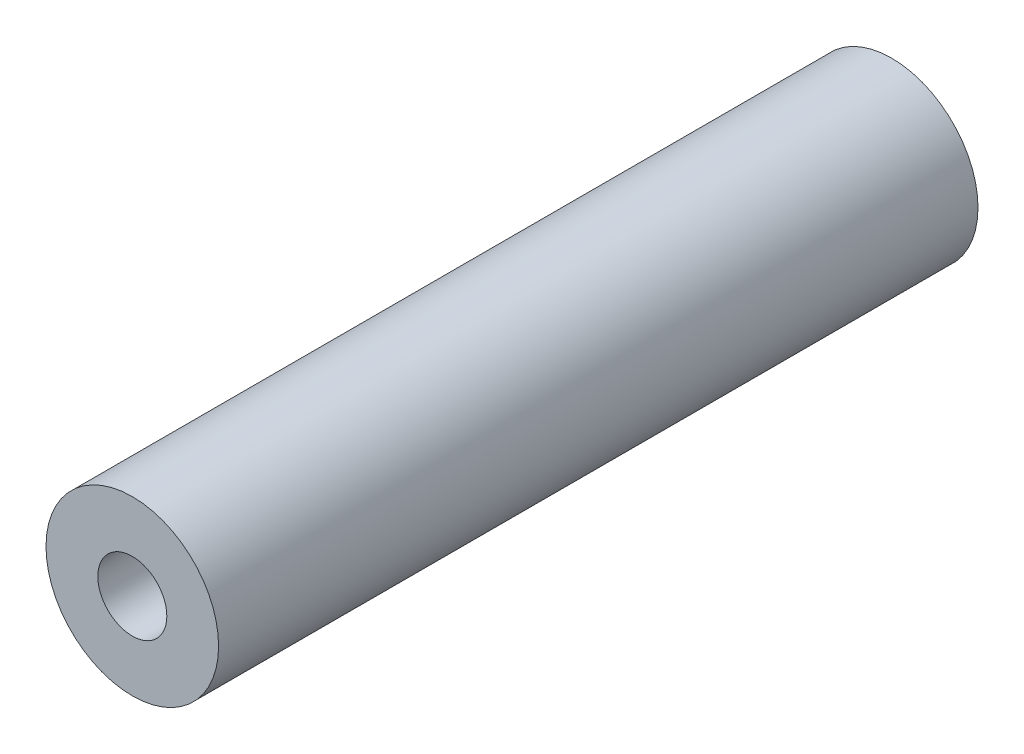
ISO-10303-21;
HEADER;
FILE_DESCRIPTION(('STEP AP214'),'2;1');
FILE_NAME('part.step','',(''),(''),'','','');
FILE_SCHEMA(('AUTOMOTIVE_DESIGN { 1 0 10303 214 1 1 1 1 }'));
ENDSEC;
DATA;
#1=APPLICATION_CONTEXT('core data for automotive mechanical design processes');
#2=APPLICATION_PROTOCOL_DEFINITION('international standard','automotive_design',2000,#1);
#3=PRODUCT_CONTEXT('',#1,'mechanical');
#4=PRODUCT('Part','Part','',(#3));
#5=PRODUCT_RELATED_PRODUCT_CATEGORY('part','',(#4));
#6=PRODUCT_DEFINITION_FORMATION('','',#4);
#7=PRODUCT_DEFINITION_CONTEXT('part definition',#1,'design');
#8=PRODUCT_DEFINITION('design','',#6,#7);
#9=PRODUCT_DEFINITION_SHAPE('','',#8);
#10=(LENGTH_UNIT() NAMED_UNIT(*) SI_UNIT(.MILLI.,.METRE.));
#11=(NAMED_UNIT(*) PLANE_ANGLE_UNIT() SI_UNIT($,.RADIAN.));
#12=(NAMED_UNIT(*) SI_UNIT($,.STERADIAN.) SOLID_ANGLE_UNIT());
#13=UNCERTAINTY_MEASURE_WITH_UNIT(LENGTH_MEASURE(1.E-05),#10,'distance_accuracy_value','');
#14=(GEOMETRIC_REPRESENTATION_CONTEXT(3) GLOBAL_UNCERTAINTY_ASSIGNED_CONTEXT((#13)) GLOBAL_UNIT_ASSIGNED_CONTEXT((#10,
#11,#12)) REPRESENTATION_CONTEXT('',''));
#15=CARTESIAN_POINT('',(0.,0.,0.));
#16=DIRECTION('',(0.,0.,1.));
#17=DIRECTION('',(1.,0.,0.));
#18=AXIS2_PLACEMENT_3D('',#15,#16,#17);
#19=CARTESIAN_POINT('',(0.,0.,-22.));
#20=DIRECTION('',(0.,0.,1.));
#21=DIRECTION('',(1.,0.,0.));
#22=AXIS2_PLACEMENT_3D('',#19,#20,#21);
#23=CYLINDRICAL_SURFACE('',#22,2.5);
#24=CARTESIAN_POINT('',(0.,0.,-22.));
#25=DIRECTION('',(0.,0.,1.));
#26=DIRECTION('',(1.,0.,0.));
#27=AXIS2_PLACEMENT_3D('',#24,#25,#26);
#28=CIRCLE('',#27,2.5);
#29=CARTESIAN_POINT('',(2.5,0.,-22.));
#30=VERTEX_POINT('',#29);
#31=EDGE_CURVE('E11',#30,#30,#28,.T.);
#32=ORIENTED_EDGE('',*,*,#31,.T.);
#33=EDGE_LOOP('',(#32));
#34=FACE_BOUND('',#33,.T.);
#35=CARTESIAN_POINT('',(0.,0.,0.));
#36=DIRECTION('',(0.,0.,1.));
#37=DIRECTION('',(1.,0.,0.));
#38=AXIS2_PLACEMENT_3D('',#35,#36,#37);
#39=CIRCLE('',#38,2.5);
#40=CARTESIAN_POINT('',(2.5,0.,0.));
#41=VERTEX_POINT('',#40);
#42=EDGE_CURVE('E48',#41,#41,#39,.T.);
#43=ORIENTED_EDGE('',*,*,#42,.F.);
#44=EDGE_LOOP('',(#43));
#45=FACE_BOUND('',#44,.T.);
#46=ADVANCED_FACE('F45',(#34,#45),#23,.T.);
#47=CARTESIAN_POINT('',(0.,0.,-22.));
#48=DIRECTION('',(0.,0.,1.));
#49=DIRECTION('',(1.,0.,0.));
#50=AXIS2_PLACEMENT_3D('',#47,#48,#49);
#51=PLANE('',#50);
#52=CARTESIAN_POINT('',(0.,0.,-22.));
#53=DIRECTION('',(0.,0.,1.));
#54=DIRECTION('',(1.,0.,0.));
#55=AXIS2_PLACEMENT_3D('',#52,#53,#54);
#56=CIRCLE('',#55,1.);
#57=CARTESIAN_POINT('',(1.,0.,-22.));
#58=VERTEX_POINT('',#57);
#59=EDGE_CURVE('E55',#58,#58,#56,.T.);
#60=ORIENTED_EDGE('',*,*,#59,.T.);
#61=EDGE_LOOP('',(#60));
#62=FACE_BOUND('',#61,.T.);
#63=ORIENTED_EDGE('',*,*,#31,.F.);
#64=EDGE_LOOP('',(#63));
#65=FACE_BOUND('',#64,.T.);
#66=ADVANCED_FACE('F63',(#62,#65),#51,.F.);
#67=CARTESIAN_POINT('',(0.,0.,0.));
#68=DIRECTION('',(0.,0.,1.));
#69=DIRECTION('',(1.,0.,0.));
#70=AXIS2_PLACEMENT_3D('',#67,#68,#69);
#71=PLANE('',#70);
#72=CARTESIAN_POINT('',(0.,0.,0.));
#73=DIRECTION('',(0.,0.,1.));
#74=DIRECTION('',(1.,0.,0.));
#75=AXIS2_PLACEMENT_3D('',#72,#73,#74);
#76=CIRCLE('',#75,1.);
#77=CARTESIAN_POINT('',(1.,0.,0.));
#78=VERTEX_POINT('',#77);
#79=EDGE_CURVE('E57',#78,#78,#76,.T.);
#80=ORIENTED_EDGE('',*,*,#79,.F.);
#81=EDGE_LOOP('',(#80));
#82=FACE_BOUND('',#81,.T.);
#83=ORIENTED_EDGE('',*,*,#42,.T.);
#84=EDGE_LOOP('',(#83));
#85=FACE_BOUND('',#84,.T.);
#86=ADVANCED_FACE('F69',(#82,#85),#71,.T.);
#87=CARTESIAN_POINT('',(0.,0.,-22.));
#88=DIRECTION('',(0.,0.,1.));
#89=DIRECTION('',(1.,0.,0.));
#90=AXIS2_PLACEMENT_3D('',#87,#88,#89);
#91=CYLINDRICAL_SURFACE('',#90,1.);
#92=ORIENTED_EDGE('',*,*,#59,.F.);
#93=EDGE_LOOP('',(#92));
#94=FACE_BOUND('',#93,.T.);
#95=ORIENTED_EDGE('',*,*,#79,.T.);
#96=EDGE_LOOP('',(#95));
#97=FACE_BOUND('',#96,.T.);
#98=ADVANCED_FACE('F66',(#94,#97),#91,.F.);
#99=CLOSED_SHELL('',(#46,#66,#86,#98));
#100=MANIFOLD_SOLID_BREP('B2',#99);
#101=ADVANCED_BREP_SHAPE_REPRESENTATION('',(#18,#100),#14);
#102=SHAPE_DEFINITION_REPRESENTATION(#9,#101);
ENDSEC;
END-ISO-10303-21;
